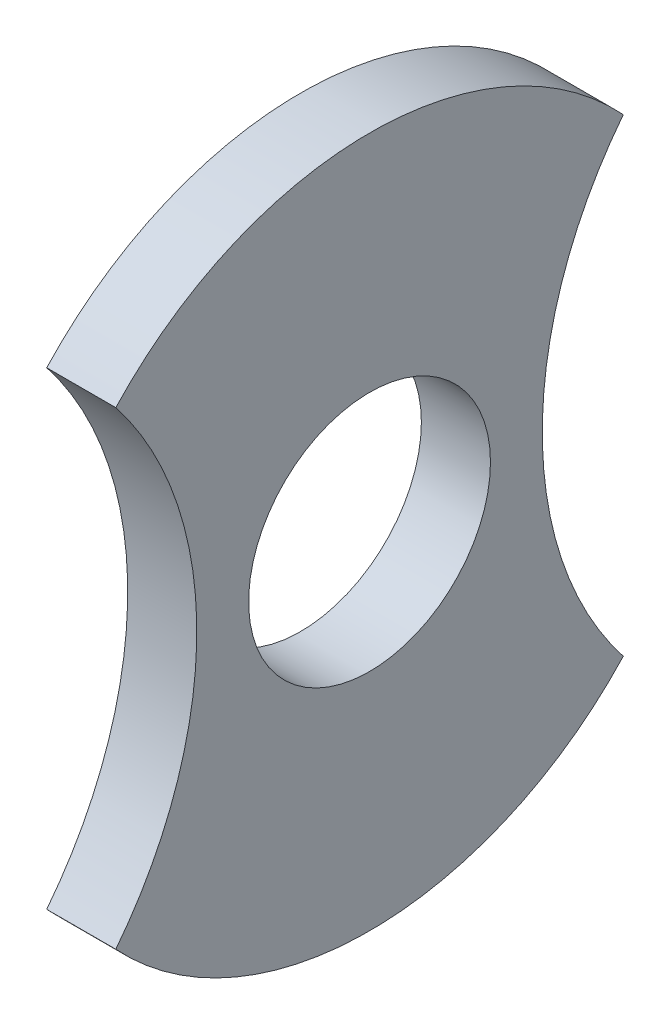
ISO-10303-21;
HEADER;
FILE_DESCRIPTION(('STEP AP214'),'2;1');
FILE_NAME('part.step','',(''),(''),'','','');
FILE_SCHEMA(('AUTOMOTIVE_DESIGN { 1 0 10303 214 1 1 1 1 }'));
ENDSEC;
DATA;
#1=APPLICATION_CONTEXT('core data for automotive mechanical design processes');
#2=APPLICATION_PROTOCOL_DEFINITION('international standard','automotive_design',2000,#1);
#3=PRODUCT_CONTEXT('',#1,'mechanical');
#4=PRODUCT('Part','Part','',(#3));
#5=PRODUCT_RELATED_PRODUCT_CATEGORY('part','',(#4));
#6=PRODUCT_DEFINITION_FORMATION('','',#4);
#7=PRODUCT_DEFINITION_CONTEXT('part definition',#1,'design');
#8=PRODUCT_DEFINITION('design','',#6,#7);
#9=PRODUCT_DEFINITION_SHAPE('','',#8);
#10=(LENGTH_UNIT() NAMED_UNIT(*) SI_UNIT(.MILLI.,.METRE.));
#11=(NAMED_UNIT(*) PLANE_ANGLE_UNIT() SI_UNIT($,.RADIAN.));
#12=(NAMED_UNIT(*) SI_UNIT($,.STERADIAN.) SOLID_ANGLE_UNIT());
#13=UNCERTAINTY_MEASURE_WITH_UNIT(LENGTH_MEASURE(1.E-05),#10,'distance_accuracy_value','');
#14=(GEOMETRIC_REPRESENTATION_CONTEXT(3) GLOBAL_UNCERTAINTY_ASSIGNED_CONTEXT((#13)) GLOBAL_UNIT_ASSIGNED_CONTEXT((#10,
#11,#12)) REPRESENTATION_CONTEXT('',''));
#15=CARTESIAN_POINT('',(0.,0.,0.));
#16=DIRECTION('',(0.,0.,1.));
#17=DIRECTION('',(1.,0.,0.));
#18=AXIS2_PLACEMENT_3D('',#15,#16,#17);
#19=CARTESIAN_POINT('',(10.,0.,0.));
#20=DIRECTION('',(-1.,0.,0.));
#21=DIRECTION('',(0.,0.,1.));
#22=AXIS2_PLACEMENT_3D('',#19,#20,#21);
#23=CYLINDRICAL_SURFACE('',#22,50.00625);
#24=CARTESIAN_POINT('',(0.,0.,0.));
#25=DIRECTION('',(1.,0.,0.));
#26=DIRECTION('',(0.,0.,1.));
#27=AXIS2_PLACEMENT_3D('',#24,#25,#26);
#28=CIRCLE('',#27,50.00625);
#29=CARTESIAN_POINT('',(0.,33.9421793507113,-36.7226564941406));
#30=VERTEX_POINT('',#29);
#31=CARTESIAN_POINT('',(0.,33.9421793507113,36.7226564941406));
#32=VERTEX_POINT('',#31);
#33=EDGE_CURVE('E97',#30,#32,#28,.T.);
#34=ORIENTED_EDGE('',*,*,#33,.T.);
#35=DIRECTION('',(-1.,0.,0.));
#36=VECTOR('',#35,1.);
#37=CARTESIAN_POINT('',(10.,33.9421793507113,36.7226564941406));
#38=LINE('',#37,#36);
#39=CARTESIAN_POINT('',(10.,33.9421793507113,36.7226564941406));
#40=VERTEX_POINT('',#39);
#41=EDGE_CURVE('E11',#40,#32,#38,.T.);
#42=ORIENTED_EDGE('',*,*,#41,.F.);
#43=CARTESIAN_POINT('',(10.,0.,0.));
#44=DIRECTION('',(1.,0.,0.));
#45=DIRECTION('',(0.,0.,1.));
#46=AXIS2_PLACEMENT_3D('',#43,#44,#45);
#47=CIRCLE('',#46,50.00625);
#48=CARTESIAN_POINT('',(10.,33.9421793507113,-36.7226564941406));
#49=VERTEX_POINT('',#48);
#50=EDGE_CURVE('E83',#49,#40,#47,.T.);
#51=ORIENTED_EDGE('',*,*,#50,.F.);
#52=DIRECTION('',(-1.,0.,0.));
#53=VECTOR('',#52,1.);
#54=CARTESIAN_POINT('',(10.,33.9421793507113,-36.7226564941406));
#55=LINE('',#54,#53);
#56=EDGE_CURVE('E93',#49,#30,#55,.T.);
#57=ORIENTED_EDGE('',*,*,#56,.T.);
#58=EDGE_LOOP('',(#34,#42,#51,#57));
#59=FACE_BOUND('',#58,.T.);
#60=ADVANCED_FACE('F33',(#59),#23,.T.);
#61=CARTESIAN_POINT('',(10.,0.,80.));
#62=DIRECTION('',(-1.,0.,0.));
#63=DIRECTION('',(0.,0.,1.));
#64=AXIS2_PLACEMENT_3D('',#61,#62,#63);
#65=CYLINDRICAL_SURFACE('',#64,55.);
#66=CARTESIAN_POINT('',(0.,0.,80.));
#67=DIRECTION('',(-1.,0.,0.));
#68=DIRECTION('',(0.,0.,-1.));
#69=AXIS2_PLACEMENT_3D('',#66,#67,#68);
#70=CIRCLE('',#69,55.);
#71=CARTESIAN_POINT('',(0.,-33.9421793507113,36.7226564941406));
#72=VERTEX_POINT('',#71);
#73=EDGE_CURVE('E88',#32,#72,#70,.T.);
#74=ORIENTED_EDGE('',*,*,#73,.T.);
#75=DIRECTION('',(-1.,0.,0.));
#76=VECTOR('',#75,1.);
#77=CARTESIAN_POINT('',(10.,-33.9421793507113,36.7226564941406));
#78=LINE('',#77,#76);
#79=CARTESIAN_POINT('',(10.,-33.9421793507113,36.7226564941406));
#80=VERTEX_POINT('',#79);
#81=EDGE_CURVE('E41',#80,#72,#78,.T.);
#82=ORIENTED_EDGE('',*,*,#81,.F.);
#83=CARTESIAN_POINT('',(10.,0.,80.));
#84=DIRECTION('',(-1.,0.,0.));
#85=DIRECTION('',(0.,0.,1.));
#86=AXIS2_PLACEMENT_3D('',#83,#84,#85);
#87=CIRCLE('',#86,55.);
#88=EDGE_CURVE('E77',#40,#80,#87,.T.);
#89=ORIENTED_EDGE('',*,*,#88,.F.);
#90=ORIENTED_EDGE('',*,*,#41,.T.);
#91=EDGE_LOOP('',(#74,#82,#89,#90));
#92=FACE_BOUND('',#91,.T.);
#93=ADVANCED_FACE('F87',(#92),#65,.F.);
#94=CARTESIAN_POINT('',(10.,0.,0.));
#95=DIRECTION('',(-1.,0.,0.));
#96=DIRECTION('',(0.,0.,1.));
#97=AXIS2_PLACEMENT_3D('',#94,#95,#96);
#98=CYLINDRICAL_SURFACE('',#97,50.00625);
#99=CARTESIAN_POINT('',(0.,0.,0.));
#100=DIRECTION('',(1.,0.,0.));
#101=DIRECTION('',(0.,0.,-1.));
#102=AXIS2_PLACEMENT_3D('',#99,#100,#101);
#103=CIRCLE('',#102,50.00625);
#104=CARTESIAN_POINT('',(0.,-33.9421793507113,-36.7226564941406));
#105=VERTEX_POINT('',#104);
#106=EDGE_CURVE('E102',#72,#105,#103,.T.);
#107=ORIENTED_EDGE('',*,*,#106,.T.);
#108=DIRECTION('',(-1.,0.,0.));
#109=VECTOR('',#108,1.);
#110=CARTESIAN_POINT('',(10.,-33.9421793507113,-36.7226564941406));
#111=LINE('',#110,#109);
#112=CARTESIAN_POINT('',(10.,-33.9421793507113,-36.7226564941406));
#113=VERTEX_POINT('',#112);
#114=EDGE_CURVE('E90',#113,#105,#111,.T.);
#115=ORIENTED_EDGE('',*,*,#114,.F.);
#116=CARTESIAN_POINT('',(10.,0.,0.));
#117=DIRECTION('',(1.,0.,0.));
#118=DIRECTION('',(0.,0.,-1.));
#119=AXIS2_PLACEMENT_3D('',#116,#117,#118);
#120=CIRCLE('',#119,50.00625);
#121=EDGE_CURVE('E80',#80,#113,#120,.T.);
#122=ORIENTED_EDGE('',*,*,#121,.F.);
#123=ORIENTED_EDGE('',*,*,#81,.T.);
#124=EDGE_LOOP('',(#107,#115,#122,#123));
#125=FACE_BOUND('',#124,.T.);
#126=ADVANCED_FACE('F91',(#125),#98,.T.);
#127=CARTESIAN_POINT('',(10.,0.,-80.));
#128=DIRECTION('',(-1.,0.,0.));
#129=DIRECTION('',(0.,0.,1.));
#130=AXIS2_PLACEMENT_3D('',#127,#128,#129);
#131=CYLINDRICAL_SURFACE('',#130,55.);
#132=CARTESIAN_POINT('',(0.,0.,-80.));
#133=DIRECTION('',(-1.,0.,0.));
#134=DIRECTION('',(0.,0.,-1.));
#135=AXIS2_PLACEMENT_3D('',#132,#133,#134);
#136=CIRCLE('',#135,55.);
#137=EDGE_CURVE('E66',#105,#30,#136,.T.);
#138=ORIENTED_EDGE('',*,*,#137,.T.);
#139=ORIENTED_EDGE('',*,*,#56,.F.);
#140=CARTESIAN_POINT('',(10.,0.,-80.));
#141=DIRECTION('',(-1.,0.,0.));
#142=DIRECTION('',(0.,0.,1.));
#143=AXIS2_PLACEMENT_3D('',#140,#141,#142);
#144=CIRCLE('',#143,55.);
#145=EDGE_CURVE('E49',#113,#49,#144,.T.);
#146=ORIENTED_EDGE('',*,*,#145,.F.);
#147=ORIENTED_EDGE('',*,*,#114,.T.);
#148=EDGE_LOOP('',(#138,#139,#146,#147));
#149=FACE_BOUND('',#148,.T.);
#150=ADVANCED_FACE('F106',(#149),#131,.F.);
#151=CARTESIAN_POINT('',(10.,0.,-40.));
#152=DIRECTION('',(-1.,0.,0.));
#153=DIRECTION('',(0.,0.,1.));
#154=AXIS2_PLACEMENT_3D('',#151,#152,#153);
#155=PLANE('',#154);
#156=CARTESIAN_POINT('',(10.,0.,0.));
#157=DIRECTION('',(1.,0.,0.));
#158=DIRECTION('',(0.,0.,-1.));
#159=AXIS2_PLACEMENT_3D('',#156,#157,#158);
#160=CIRCLE('',#159,17.5);
#161=CARTESIAN_POINT('',(10.,0.,-17.5));
#162=VERTEX_POINT('',#161);
#163=EDGE_CURVE('E100',#162,#162,#160,.T.);
#164=ORIENTED_EDGE('',*,*,#163,.F.);
#165=EDGE_LOOP('',(#164));
#166=FACE_BOUND('',#165,.T.);
#167=ORIENTED_EDGE('',*,*,#50,.T.);
#168=ORIENTED_EDGE('',*,*,#88,.T.);
#169=ORIENTED_EDGE('',*,*,#121,.T.);
#170=ORIENTED_EDGE('',*,*,#145,.T.);
#171=EDGE_LOOP('',(#167,#168,#169,#170));
#172=FACE_BOUND('',#171,.T.);
#173=ADVANCED_FACE('F78',(#166,#172),#155,.F.);
#174=CARTESIAN_POINT('',(0.,0.,-40.));
#175=DIRECTION('',(-1.,0.,0.));
#176=DIRECTION('',(0.,0.,1.));
#177=AXIS2_PLACEMENT_3D('',#174,#175,#176);
#178=PLANE('',#177);
#179=CARTESIAN_POINT('',(0.,0.,0.));
#180=DIRECTION('',(1.,0.,0.));
#181=DIRECTION('',(0.,0.,-1.));
#182=AXIS2_PLACEMENT_3D('',#179,#180,#181);
#183=CIRCLE('',#182,17.5);
#184=CARTESIAN_POINT('',(0.,0.,-17.5));
#185=VERTEX_POINT('',#184);
#186=EDGE_CURVE('E109',#185,#185,#183,.T.);
#187=ORIENTED_EDGE('',*,*,#186,.T.);
#188=EDGE_LOOP('',(#187));
#189=FACE_BOUND('',#188,.T.);
#190=ORIENTED_EDGE('',*,*,#33,.F.);
#191=ORIENTED_EDGE('',*,*,#137,.F.);
#192=ORIENTED_EDGE('',*,*,#106,.F.);
#193=ORIENTED_EDGE('',*,*,#73,.F.);
#194=EDGE_LOOP('',(#190,#191,#192,#193));
#195=FACE_BOUND('',#194,.T.);
#196=ADVANCED_FACE('F119',(#189,#195),#178,.T.);
#197=CARTESIAN_POINT('',(10.,0.,0.));
#198=DIRECTION('',(-1.,0.,0.));
#199=DIRECTION('',(0.,0.,1.));
#200=AXIS2_PLACEMENT_3D('',#197,#198,#199);
#201=CYLINDRICAL_SURFACE('',#200,17.5);
#202=ORIENTED_EDGE('',*,*,#163,.T.);
#203=EDGE_LOOP('',(#202));
#204=FACE_BOUND('',#203,.T.);
#205=ORIENTED_EDGE('',*,*,#186,.F.);
#206=EDGE_LOOP('',(#205));
#207=FACE_BOUND('',#206,.T.);
#208=ADVANCED_FACE('F115',(#204,#207),#201,.F.);
#209=CLOSED_SHELL('',(#60,#93,#126,#150,#173,#196,#208));
#210=MANIFOLD_SOLID_BREP('B2',#209);
#211=ADVANCED_BREP_SHAPE_REPRESENTATION('',(#18,#210),#14);
#212=SHAPE_DEFINITION_REPRESENTATION(#9,#211);
ENDSEC;
END-ISO-10303-21;
